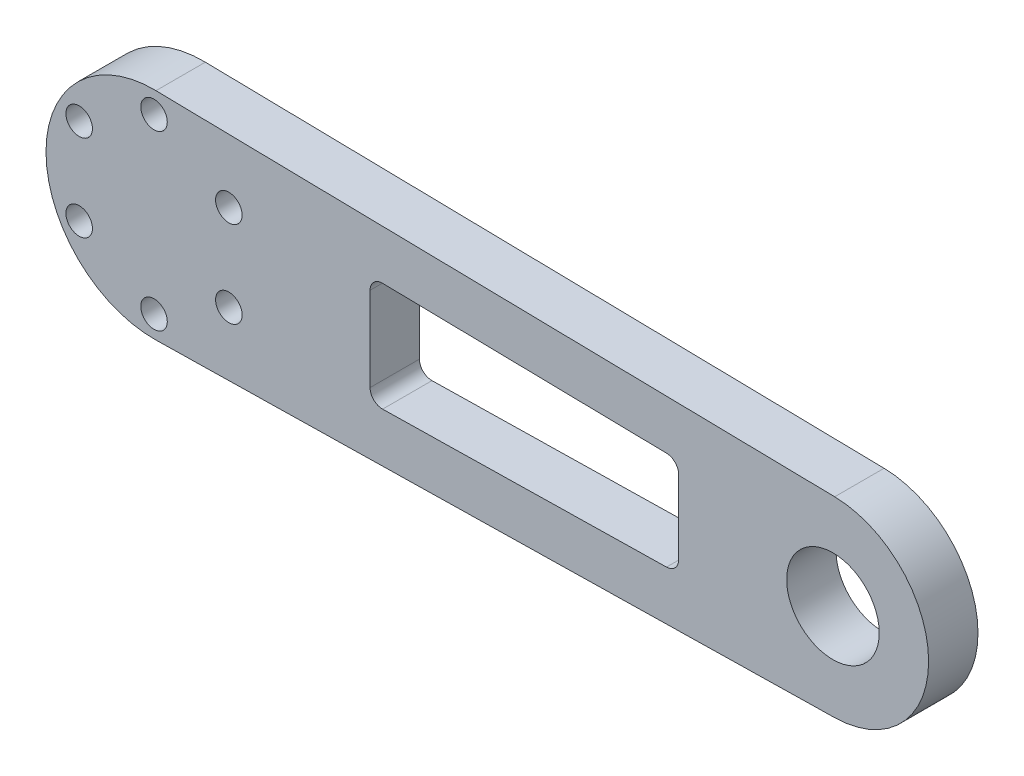
ISO-10303-21;
HEADER;
FILE_DESCRIPTION(('STEP AP214'),'2;1');
FILE_NAME('part.step','',(''),(''),'','','');
FILE_SCHEMA(('AUTOMOTIVE_DESIGN { 1 0 10303 214 1 1 1 1 }'));
ENDSEC;
DATA;
#1=APPLICATION_CONTEXT('core data for automotive mechanical design processes');
#2=APPLICATION_PROTOCOL_DEFINITION('international standard','automotive_design',2000,#1);
#3=PRODUCT_CONTEXT('',#1,'mechanical');
#4=PRODUCT('Part','Part','',(#3));
#5=PRODUCT_RELATED_PRODUCT_CATEGORY('part','',(#4));
#6=PRODUCT_DEFINITION_FORMATION('','',#4);
#7=PRODUCT_DEFINITION_CONTEXT('part definition',#1,'design');
#8=PRODUCT_DEFINITION('design','',#6,#7);
#9=PRODUCT_DEFINITION_SHAPE('','',#8);
#10=(LENGTH_UNIT() NAMED_UNIT(*) SI_UNIT(.MILLI.,.METRE.));
#11=(NAMED_UNIT(*) PLANE_ANGLE_UNIT() SI_UNIT($,.RADIAN.));
#12=(NAMED_UNIT(*) SI_UNIT($,.STERADIAN.) SOLID_ANGLE_UNIT());
#13=UNCERTAINTY_MEASURE_WITH_UNIT(LENGTH_MEASURE(1.E-05),#10,'distance_accuracy_value','');
#14=(GEOMETRIC_REPRESENTATION_CONTEXT(3) GLOBAL_UNCERTAINTY_ASSIGNED_CONTEXT((#13)) GLOBAL_UNIT_ASSIGNED_CONTEXT((#10,
#11,#12)) REPRESENTATION_CONTEXT('',''));
#15=CARTESIAN_POINT('',(0.,0.,0.));
#16=DIRECTION('',(0.,0.,1.));
#17=DIRECTION('',(1.,0.,0.));
#18=AXIS2_PLACEMENT_3D('',#15,#16,#17);
#19=CARTESIAN_POINT('',(0.,0.,8.));
#20=DIRECTION('',(0.,0.,1.));
#21=DIRECTION('',(1.,0.,0.));
#22=AXIS2_PLACEMENT_3D('',#19,#20,#21);
#23=PLANE('',#22);
#24=CARTESIAN_POINT('',(12.1243556529825,7.00000000000069,8.));
#25=DIRECTION('',(0.,0.,1.));
#26=DIRECTION('',(1.,0.,0.));
#27=AXIS2_PLACEMENT_3D('',#24,#25,#26);
#28=CIRCLE('',#27,2.15);
#29=CARTESIAN_POINT('',(14.2743556529825,7.00000000000069,8.));
#30=VERTEX_POINT('',#29);
#31=EDGE_CURVE('E529',#30,#30,#28,.T.);
#32=ORIENTED_EDGE('',*,*,#31,.F.);
#33=EDGE_LOOP('',(#32));
#34=FACE_BOUND('',#33,.T.);
#35=CARTESIAN_POINT('',(0.,14.,8.));
#36=DIRECTION('',(0.,0.,1.));
#37=DIRECTION('',(1.,0.,0.));
#38=AXIS2_PLACEMENT_3D('',#35,#36,#37);
#39=CIRCLE('',#38,2.15);
#40=CARTESIAN_POINT('',(2.15,14.,8.));
#41=VERTEX_POINT('',#40);
#42=EDGE_CURVE('E532',#41,#41,#39,.T.);
#43=ORIENTED_EDGE('',*,*,#42,.F.);
#44=EDGE_LOOP('',(#43));
#45=FACE_BOUND('',#44,.T.);
#46=CARTESIAN_POINT('',(-12.1243556529818,6.9999999999993,8.));
#47=DIRECTION('',(0.,0.,1.));
#48=DIRECTION('',(1.,0.,0.));
#49=AXIS2_PLACEMENT_3D('',#46,#47,#48);
#50=CIRCLE('',#49,2.15);
#51=CARTESIAN_POINT('',(-9.97435565298175,6.9999999999993,8.));
#52=VERTEX_POINT('',#51);
#53=EDGE_CURVE('E247',#52,#52,#50,.T.);
#54=ORIENTED_EDGE('',*,*,#53,.F.);
#55=EDGE_LOOP('',(#54));
#56=FACE_BOUND('',#55,.T.);
#57=CARTESIAN_POINT('',(-12.124355652981,-7.00000000000069,8.));
#58=DIRECTION('',(0.,0.,1.));
#59=DIRECTION('',(1.,0.,0.));
#60=AXIS2_PLACEMENT_3D('',#57,#58,#59);
#61=CIRCLE('',#60,2.15);
#62=CARTESIAN_POINT('',(-9.97435565298095,-7.00000000000069,8.));
#63=VERTEX_POINT('',#62);
#64=EDGE_CURVE('E236',#63,#63,#61,.T.);
#65=ORIENTED_EDGE('',*,*,#64,.F.);
#66=EDGE_LOOP('',(#65));
#67=FACE_BOUND('',#66,.T.);
#68=CARTESIAN_POINT('',(1.58647221154621E-12,-14.,8.));
#69=DIRECTION('',(0.,0.,1.));
#70=DIRECTION('',(1.,0.,0.));
#71=AXIS2_PLACEMENT_3D('',#68,#69,#70);
#72=CIRCLE('',#71,2.15);
#73=CARTESIAN_POINT('',(2.15000000000158,-14.,8.));
#74=VERTEX_POINT('',#73);
#75=EDGE_CURVE('E233',#74,#74,#72,.T.);
#76=ORIENTED_EDGE('',*,*,#75,.F.);
#77=EDGE_LOOP('',(#76));
#78=FACE_BOUND('',#77,.T.);
#79=CARTESIAN_POINT('',(12.1243556529833,-6.99999999999931,8.));
#80=DIRECTION('',(0.,0.,1.));
#81=DIRECTION('',(1.,0.,0.));
#82=AXIS2_PLACEMENT_3D('',#79,#80,#81);
#83=CIRCLE('',#82,2.15);
#84=CARTESIAN_POINT('',(14.2743556529833,-6.99999999999931,8.));
#85=VERTEX_POINT('',#84);
#86=EDGE_CURVE('E230',#85,#85,#83,.T.);
#87=ORIENTED_EDGE('',*,*,#86,.F.);
#88=EDGE_LOOP('',(#87));
#89=FACE_BOUND('',#88,.T.);
#90=CARTESIAN_POINT('',(0.,0.,8.));
#91=DIRECTION('',(0.,0.,1.));
#92=DIRECTION('',(1.,0.,0.));
#93=AXIS2_PLACEMENT_3D('',#90,#91,#92);
#94=CIRCLE('',#93,17.5);
#95=CARTESIAN_POINT('',(0.318181818181819,17.4971071989223,8.));
#96=VERTEX_POINT('',#95);
#97=CARTESIAN_POINT('',(0.318181818181819,-17.4971071989223,8.));
#98=VERTEX_POINT('',#97);
#99=EDGE_CURVE('E203',#96,#98,#94,.T.);
#100=ORIENTED_EDGE('',*,*,#99,.T.);
#101=DIRECTION('',(0.999834697081274,0.0181818181818182,0.));
#102=VECTOR('',#101,1.);
#103=CARTESIAN_POINT('',(0.318181818181819,-17.4971071989223,8.));
#104=LINE('',#103,#102);
#105=CARTESIAN_POINT('',(110.281818181818,-15.4974378047597,8.));
#106=VERTEX_POINT('',#105);
#107=EDGE_CURVE('E206',#98,#106,#104,.T.);
#108=ORIENTED_EDGE('',*,*,#107,.T.);
#109=CARTESIAN_POINT('',(110.,0.,8.));
#110=DIRECTION('',(0.,0.,1.));
#111=DIRECTION('',(-1.,0.,0.));
#112=AXIS2_PLACEMENT_3D('',#109,#110,#111);
#113=CIRCLE('',#112,15.5);
#114=CARTESIAN_POINT('',(110.281818181818,15.4974378047597,8.));
#115=VERTEX_POINT('',#114);
#116=EDGE_CURVE('E209',#106,#115,#113,.T.);
#117=ORIENTED_EDGE('',*,*,#116,.T.);
#118=DIRECTION('',(-0.999834697081274,0.0181818181818182,0.));
#119=VECTOR('',#118,1.);
#120=CARTESIAN_POINT('',(0.318181818181819,17.4971071989223,8.));
#121=LINE('',#120,#119);
#122=EDGE_CURVE('E211',#115,#96,#121,.T.);
#123=ORIENTED_EDGE('',*,*,#122,.T.);
#124=EDGE_LOOP('',(#100,#108,#117,#123));
#125=FACE_BOUND('',#124,.T.);
#126=CARTESIAN_POINT('',(110.,0.,8.));
#127=DIRECTION('',(0.,0.,1.));
#128=DIRECTION('',(1.,0.,0.));
#129=AXIS2_PLACEMENT_3D('',#126,#127,#128);
#130=CIRCLE('',#129,7.50000000000001);
#131=CARTESIAN_POINT('',(117.5,0.,8.));
#132=VERTEX_POINT('',#131);
#133=EDGE_CURVE('E197',#132,#132,#130,.T.);
#134=ORIENTED_EDGE('',*,*,#133,.F.);
#135=EDGE_LOOP('',(#134));
#136=FACE_BOUND('',#135,.T.);
#137=DIRECTION('',(-0.999834697081274,0.0181818181818182,0.));
#138=VECTOR('',#137,1.);
#139=CARTESIAN_POINT('',(37.0363636363636,8.82807087613048,8.));
#140=LINE('',#139,#138);
#141=CARTESIAN_POINT('',(83.0363636363636,7.99156896355917,8.));
#142=VERTEX_POINT('',#141);
#143=CARTESIAN_POINT('',(37.0363636363636,8.82807087613048,8.));
#144=VERTEX_POINT('',#143);
#145=EDGE_CURVE('E138',#142,#144,#140,.T.);
#146=ORIENTED_EDGE('',*,*,#145,.F.);
#147=CARTESIAN_POINT('',(83.,5.99189956939662,8.));
#148=DIRECTION('',(0.,0.,1.));
#149=DIRECTION('',(-1.,0.,0.));
#150=AXIS2_PLACEMENT_3D('',#147,#148,#149);
#151=CIRCLE('',#150,2.00000000000001);
#152=CARTESIAN_POINT('',(85.,5.99189956939662,8.));
#153=VERTEX_POINT('',#152);
#154=EDGE_CURVE('E130',#153,#142,#151,.T.);
#155=ORIENTED_EDGE('',*,*,#154,.F.);
#156=DIRECTION('',(0.,1.,0.));
#157=VECTOR('',#156,1.);
#158=CARTESIAN_POINT('',(85.,5.99189956939662,8.));
#159=LINE('',#158,#157);
#160=CARTESIAN_POINT('',(85.,-5.99189956939662,8.));
#161=VERTEX_POINT('',#160);
#162=EDGE_CURVE('E164',#161,#153,#159,.T.);
#163=ORIENTED_EDGE('',*,*,#162,.F.);
#164=CARTESIAN_POINT('',(83.,-5.99189956939662,8.));
#165=DIRECTION('',(0.,0.,1.));
#166=DIRECTION('',(1.,0.,0.));
#167=AXIS2_PLACEMENT_3D('',#164,#165,#166);
#168=CIRCLE('',#167,2.00000000000001);
#169=CARTESIAN_POINT('',(83.0363636363636,-7.99156896355917,8.));
#170=VERTEX_POINT('',#169);
#171=EDGE_CURVE('E162',#170,#161,#168,.T.);
#172=ORIENTED_EDGE('',*,*,#171,.F.);
#173=DIRECTION('',(0.999834697081274,0.0181818181818182,0.));
#174=VECTOR('',#173,1.);
#175=CARTESIAN_POINT('',(37.0363636363636,-8.82807087613048,8.));
#176=LINE('',#175,#174);
#177=CARTESIAN_POINT('',(37.0363636363636,-8.82807087613048,8.));
#178=VERTEX_POINT('',#177);
#179=EDGE_CURVE('E160',#178,#170,#176,.T.);
#180=ORIENTED_EDGE('',*,*,#179,.F.);
#181=CARTESIAN_POINT('',(37.,-6.82840148196793,8.));
#182=DIRECTION('',(0.,0.,1.));
#183=DIRECTION('',(1.,0.,0.));
#184=AXIS2_PLACEMENT_3D('',#181,#182,#183);
#185=CIRCLE('',#184,2.);
#186=CARTESIAN_POINT('',(35.,-6.82840148196793,8.));
#187=VERTEX_POINT('',#186);
#188=EDGE_CURVE('E158',#187,#178,#185,.T.);
#189=ORIENTED_EDGE('',*,*,#188,.F.);
#190=DIRECTION('',(0.,-1.,0.));
#191=VECTOR('',#190,1.);
#192=CARTESIAN_POINT('',(35.,6.82840148196793,8.));
#193=LINE('',#192,#191);
#194=CARTESIAN_POINT('',(35.,6.82840148196793,8.));
#195=VERTEX_POINT('',#194);
#196=EDGE_CURVE('E153',#195,#187,#193,.T.);
#197=ORIENTED_EDGE('',*,*,#196,.F.);
#198=CARTESIAN_POINT('',(37.,6.82840148196793,8.));
#199=DIRECTION('',(0.,0.,1.));
#200=DIRECTION('',(-1.,0.,0.));
#201=AXIS2_PLACEMENT_3D('',#198,#199,#200);
#202=CIRCLE('',#201,2.);
#203=EDGE_CURVE('E151',#144,#195,#202,.T.);
#204=ORIENTED_EDGE('',*,*,#203,.F.);
#205=EDGE_LOOP('',(#146,#155,#163,#172,#180,#189,#197,#204));
#206=FACE_BOUND('',#205,.T.);
#207=ADVANCED_FACE('F39',(#34,#45,#56,#67,#78,#89,#125,#136,#206),#23,.T.);
#208=CARTESIAN_POINT('',(0.,0.,0.));
#209=DIRECTION('',(0.,0.,1.));
#210=DIRECTION('',(1.,0.,0.));
#211=AXIS2_PLACEMENT_3D('',#208,#209,#210);
#212=PLANE('',#211);
#213=CARTESIAN_POINT('',(12.1243556529825,7.00000000000069,0.));
#214=DIRECTION('',(0.,0.,1.));
#215=DIRECTION('',(1.,0.,0.));
#216=AXIS2_PLACEMENT_3D('',#213,#214,#215);
#217=CIRCLE('',#216,2.15);
#218=CARTESIAN_POINT('',(14.2743556529825,7.00000000000069,0.));
#219=VERTEX_POINT('',#218);
#220=EDGE_CURVE('E43',#219,#219,#217,.T.);
#221=ORIENTED_EDGE('',*,*,#220,.T.);
#222=EDGE_LOOP('',(#221));
#223=FACE_BOUND('',#222,.T.);
#224=CARTESIAN_POINT('',(0.,14.,0.));
#225=DIRECTION('',(0.,0.,1.));
#226=DIRECTION('',(1.,0.,0.));
#227=AXIS2_PLACEMENT_3D('',#224,#225,#226);
#228=CIRCLE('',#227,2.15);
#229=CARTESIAN_POINT('',(2.15,14.,0.));
#230=VERTEX_POINT('',#229);
#231=EDGE_CURVE('E534',#230,#230,#228,.T.);
#232=ORIENTED_EDGE('',*,*,#231,.T.);
#233=EDGE_LOOP('',(#232));
#234=FACE_BOUND('',#233,.T.);
#235=CARTESIAN_POINT('',(-12.1243556529818,6.9999999999993,0.));
#236=DIRECTION('',(0.,0.,1.));
#237=DIRECTION('',(1.,0.,0.));
#238=AXIS2_PLACEMENT_3D('',#235,#236,#237);
#239=CIRCLE('',#238,2.15);
#240=CARTESIAN_POINT('',(-9.97435565298176,6.9999999999993,0.));
#241=VERTEX_POINT('',#240);
#242=EDGE_CURVE('E242',#241,#241,#239,.T.);
#243=ORIENTED_EDGE('',*,*,#242,.T.);
#244=EDGE_LOOP('',(#243));
#245=FACE_BOUND('',#244,.T.);
#246=CARTESIAN_POINT('',(-12.124355652981,-7.00000000000069,0.));
#247=DIRECTION('',(0.,0.,1.));
#248=DIRECTION('',(1.,0.,0.));
#249=AXIS2_PLACEMENT_3D('',#246,#247,#248);
#250=CIRCLE('',#249,2.15);
#251=CARTESIAN_POINT('',(-9.97435565298096,-7.00000000000069,0.));
#252=VERTEX_POINT('',#251);
#253=EDGE_CURVE('E234',#252,#252,#250,.T.);
#254=ORIENTED_EDGE('',*,*,#253,.T.);
#255=EDGE_LOOP('',(#254));
#256=FACE_BOUND('',#255,.T.);
#257=CARTESIAN_POINT('',(1.58647221154621E-12,-14.,0.));
#258=DIRECTION('',(0.,0.,1.));
#259=DIRECTION('',(1.,0.,0.));
#260=AXIS2_PLACEMENT_3D('',#257,#258,#259);
#261=CIRCLE('',#260,2.15);
#262=CARTESIAN_POINT('',(2.15000000000158,-14.,0.));
#263=VERTEX_POINT('',#262);
#264=EDGE_CURVE('E231',#263,#263,#261,.T.);
#265=ORIENTED_EDGE('',*,*,#264,.T.);
#266=EDGE_LOOP('',(#265));
#267=FACE_BOUND('',#266,.T.);
#268=CARTESIAN_POINT('',(12.1243556529833,-6.99999999999931,0.));
#269=DIRECTION('',(0.,0.,1.));
#270=DIRECTION('',(1.,0.,0.));
#271=AXIS2_PLACEMENT_3D('',#268,#269,#270);
#272=CIRCLE('',#271,2.15);
#273=CARTESIAN_POINT('',(14.2743556529833,-6.99999999999931,0.));
#274=VERTEX_POINT('',#273);
#275=EDGE_CURVE('E167',#274,#274,#272,.T.);
#276=ORIENTED_EDGE('',*,*,#275,.T.);
#277=EDGE_LOOP('',(#276));
#278=FACE_BOUND('',#277,.T.);
#279=CARTESIAN_POINT('',(110.,0.,0.));
#280=DIRECTION('',(0.,0.,1.));
#281=DIRECTION('',(1.,0.,0.));
#282=AXIS2_PLACEMENT_3D('',#279,#280,#281);
#283=CIRCLE('',#282,7.50000000000001);
#284=CARTESIAN_POINT('',(117.5,0.,0.));
#285=VERTEX_POINT('',#284);
#286=EDGE_CURVE('E146',#285,#285,#283,.T.);
#287=ORIENTED_EDGE('',*,*,#286,.T.);
#288=EDGE_LOOP('',(#287));
#289=FACE_BOUND('',#288,.T.);
#290=CARTESIAN_POINT('',(0.,0.,0.));
#291=DIRECTION('',(0.,0.,1.));
#292=DIRECTION('',(1.,0.,0.));
#293=AXIS2_PLACEMENT_3D('',#290,#291,#292);
#294=CIRCLE('',#293,17.5);
#295=CARTESIAN_POINT('',(0.318181818181819,17.4971071989223,0.));
#296=VERTEX_POINT('',#295);
#297=CARTESIAN_POINT('',(0.318181818181819,-17.4971071989223,0.));
#298=VERTEX_POINT('',#297);
#299=EDGE_CURVE('E200',#296,#298,#294,.T.);
#300=ORIENTED_EDGE('',*,*,#299,.F.);
#301=DIRECTION('',(-0.999834697081274,0.0181818181818182,0.));
#302=VECTOR('',#301,1.);
#303=CARTESIAN_POINT('',(0.318181818181819,17.4971071989223,0.));
#304=LINE('',#303,#302);
#305=CARTESIAN_POINT('',(110.281818181818,15.4974378047597,0.));
#306=VERTEX_POINT('',#305);
#307=EDGE_CURVE('E207',#306,#296,#304,.T.);
#308=ORIENTED_EDGE('',*,*,#307,.F.);
#309=CARTESIAN_POINT('',(110.,0.,0.));
#310=DIRECTION('',(0.,0.,1.));
#311=DIRECTION('',(-1.,0.,0.));
#312=AXIS2_PLACEMENT_3D('',#309,#310,#311);
#313=CIRCLE('',#312,15.5);
#314=CARTESIAN_POINT('',(110.281818181818,-15.4974378047597,0.));
#315=VERTEX_POINT('',#314);
#316=EDGE_CURVE('E218',#315,#306,#313,.T.);
#317=ORIENTED_EDGE('',*,*,#316,.F.);
#318=DIRECTION('',(0.999834697081274,0.0181818181818182,0.));
#319=VECTOR('',#318,1.);
#320=CARTESIAN_POINT('',(0.318181818181819,-17.4971071989223,0.));
#321=LINE('',#320,#319);
#322=EDGE_CURVE('E216',#298,#315,#321,.T.);
#323=ORIENTED_EDGE('',*,*,#322,.F.);
#324=EDGE_LOOP('',(#300,#308,#317,#323));
#325=FACE_BOUND('',#324,.T.);
#326=CARTESIAN_POINT('',(83.,5.99189956939662,0.));
#327=DIRECTION('',(0.,0.,1.));
#328=DIRECTION('',(-1.,0.,0.));
#329=AXIS2_PLACEMENT_3D('',#326,#327,#328);
#330=CIRCLE('',#329,2.00000000000001);
#331=CARTESIAN_POINT('',(85.,5.99189956939662,0.));
#332=VERTEX_POINT('',#331);
#333=CARTESIAN_POINT('',(83.0363636363636,7.99156896355917,0.));
#334=VERTEX_POINT('',#333);
#335=EDGE_CURVE('E64',#332,#334,#330,.T.);
#336=ORIENTED_EDGE('',*,*,#335,.T.);
#337=DIRECTION('',(-0.999834697081274,0.0181818181818182,0.));
#338=VECTOR('',#337,1.);
#339=CARTESIAN_POINT('',(37.0363636363636,8.82807087613048,0.));
#340=LINE('',#339,#338);
#341=CARTESIAN_POINT('',(37.0363636363636,8.82807087613048,0.));
#342=VERTEX_POINT('',#341);
#343=EDGE_CURVE('E145',#334,#342,#340,.T.);
#344=ORIENTED_EDGE('',*,*,#343,.T.);
#345=CARTESIAN_POINT('',(37.,6.82840148196793,0.));
#346=DIRECTION('',(0.,0.,1.));
#347=DIRECTION('',(-1.,0.,0.));
#348=AXIS2_PLACEMENT_3D('',#345,#346,#347);
#349=CIRCLE('',#348,2.);
#350=CARTESIAN_POINT('',(35.,6.82840148196793,0.));
#351=VERTEX_POINT('',#350);
#352=EDGE_CURVE('E169',#342,#351,#349,.T.);
#353=ORIENTED_EDGE('',*,*,#352,.T.);
#354=DIRECTION('',(0.,-1.,0.));
#355=VECTOR('',#354,1.);
#356=CARTESIAN_POINT('',(35.,6.82840148196793,0.));
#357=LINE('',#356,#355);
#358=CARTESIAN_POINT('',(35.,-6.82840148196793,0.));
#359=VERTEX_POINT('',#358);
#360=EDGE_CURVE('E172',#351,#359,#357,.T.);
#361=ORIENTED_EDGE('',*,*,#360,.T.);
#362=CARTESIAN_POINT('',(37.,-6.82840148196793,0.));
#363=DIRECTION('',(0.,0.,1.));
#364=DIRECTION('',(1.,0.,0.));
#365=AXIS2_PLACEMENT_3D('',#362,#363,#364);
#366=CIRCLE('',#365,2.);
#367=CARTESIAN_POINT('',(37.0363636363636,-8.82807087613048,0.));
#368=VERTEX_POINT('',#367);
#369=EDGE_CURVE('E175',#359,#368,#366,.T.);
#370=ORIENTED_EDGE('',*,*,#369,.T.);
#371=DIRECTION('',(0.999834697081274,0.0181818181818182,0.));
#372=VECTOR('',#371,1.);
#373=CARTESIAN_POINT('',(37.0363636363636,-8.82807087613048,0.));
#374=LINE('',#373,#372);
#375=CARTESIAN_POINT('',(83.0363636363636,-7.99156896355917,0.));
#376=VERTEX_POINT('',#375);
#377=EDGE_CURVE('E178',#368,#376,#374,.T.);
#378=ORIENTED_EDGE('',*,*,#377,.T.);
#379=CARTESIAN_POINT('',(83.,-5.99189956939662,0.));
#380=DIRECTION('',(0.,0.,1.));
#381=DIRECTION('',(1.,0.,0.));
#382=AXIS2_PLACEMENT_3D('',#379,#380,#381);
#383=CIRCLE('',#382,2.00000000000001);
#384=CARTESIAN_POINT('',(85.,-5.99189956939662,0.));
#385=VERTEX_POINT('',#384);
#386=EDGE_CURVE('E181',#376,#385,#383,.T.);
#387=ORIENTED_EDGE('',*,*,#386,.T.);
#388=DIRECTION('',(0.,1.,0.));
#389=VECTOR('',#388,1.);
#390=CARTESIAN_POINT('',(85.,5.99189956939662,0.));
#391=LINE('',#390,#389);
#392=EDGE_CURVE('E139',#385,#332,#391,.T.);
#393=ORIENTED_EDGE('',*,*,#392,.T.);
#394=EDGE_LOOP('',(#336,#344,#353,#361,#370,#378,#387,#393));
#395=FACE_BOUND('',#394,.T.);
#396=ADVANCED_FACE('F258',(#223,#234,#245,#256,#267,#278,#289,#325,#395),#212,.F.);
#397=CARTESIAN_POINT('',(0.,0.,8.));
#398=DIRECTION('',(0.,0.,-1.));
#399=DIRECTION('',(-1.,0.,0.));
#400=AXIS2_PLACEMENT_3D('',#397,#398,#399);
#401=CYLINDRICAL_SURFACE('',#400,17.5);
#402=ORIENTED_EDGE('',*,*,#299,.T.);
#403=DIRECTION('',(0.,0.,-1.));
#404=VECTOR('',#403,1.);
#405=CARTESIAN_POINT('',(0.318181818181819,-17.4971071989223,8.));
#406=LINE('',#405,#404);
#407=EDGE_CURVE('E11',#98,#298,#406,.T.);
#408=ORIENTED_EDGE('',*,*,#407,.F.);
#409=ORIENTED_EDGE('',*,*,#99,.F.);
#410=DIRECTION('',(0.,0.,-1.));
#411=VECTOR('',#410,1.);
#412=CARTESIAN_POINT('',(0.318181818181819,17.4971071989223,8.));
#413=LINE('',#412,#411);
#414=EDGE_CURVE('E213',#96,#296,#413,.T.);
#415=ORIENTED_EDGE('',*,*,#414,.T.);
#416=EDGE_LOOP('',(#402,#408,#409,#415));
#417=FACE_BOUND('',#416,.T.);
#418=ADVANCED_FACE('F41',(#417),#401,.T.);
#419=CARTESIAN_POINT('',(0.318181818181819,-17.4971071989223,8.));
#420=DIRECTION('',(-0.0181818181818182,0.999834697081274,0.));
#421=DIRECTION('',(-0.999834697081274,-0.0181818181818182,0.));
#422=AXIS2_PLACEMENT_3D('',#419,#420,#421);
#423=PLANE('',#422);
#424=ORIENTED_EDGE('',*,*,#322,.T.);
#425=DIRECTION('',(0.,0.,-1.));
#426=VECTOR('',#425,1.);
#427=CARTESIAN_POINT('',(110.281818181818,-15.4974378047597,8.));
#428=LINE('',#427,#426);
#429=EDGE_CURVE('E48',#106,#315,#428,.T.);
#430=ORIENTED_EDGE('',*,*,#429,.F.);
#431=ORIENTED_EDGE('',*,*,#107,.F.);
#432=ORIENTED_EDGE('',*,*,#407,.T.);
#433=EDGE_LOOP('',(#424,#430,#431,#432));
#434=FACE_BOUND('',#433,.T.);
#435=ADVANCED_FACE('F320',(#434),#423,.F.);
#436=CARTESIAN_POINT('',(110.,0.,8.));
#437=DIRECTION('',(0.,0.,-1.));
#438=DIRECTION('',(-1.,0.,0.));
#439=AXIS2_PLACEMENT_3D('',#436,#437,#438);
#440=CYLINDRICAL_SURFACE('',#439,15.5);
#441=ORIENTED_EDGE('',*,*,#316,.T.);
#442=DIRECTION('',(0.,0.,-1.));
#443=VECTOR('',#442,1.);
#444=CARTESIAN_POINT('',(110.281818181818,15.4974378047597,8.));
#445=LINE('',#444,#443);
#446=EDGE_CURVE('E223',#115,#306,#445,.T.);
#447=ORIENTED_EDGE('',*,*,#446,.F.);
#448=ORIENTED_EDGE('',*,*,#116,.F.);
#449=ORIENTED_EDGE('',*,*,#429,.T.);
#450=EDGE_LOOP('',(#441,#447,#448,#449));
#451=FACE_BOUND('',#450,.T.);
#452=ADVANCED_FACE('F317',(#451),#440,.T.);
#453=CARTESIAN_POINT('',(0.318181818181819,17.4971071989223,8.));
#454=DIRECTION('',(-0.0181818181818182,-0.999834697081274,0.));
#455=DIRECTION('',(0.999834697081274,-0.0181818181818182,0.));
#456=AXIS2_PLACEMENT_3D('',#453,#454,#455);
#457=PLANE('',#456);
#458=ORIENTED_EDGE('',*,*,#307,.T.);
#459=ORIENTED_EDGE('',*,*,#414,.F.);
#460=ORIENTED_EDGE('',*,*,#122,.F.);
#461=ORIENTED_EDGE('',*,*,#446,.T.);
#462=EDGE_LOOP('',(#458,#459,#460,#461));
#463=FACE_BOUND('',#462,.T.);
#464=ADVANCED_FACE('F269',(#463),#457,.F.);
#465=CARTESIAN_POINT('',(110.,0.,8.));
#466=DIRECTION('',(0.,0.,-1.));
#467=DIRECTION('',(-1.,0.,0.));
#468=AXIS2_PLACEMENT_3D('',#465,#466,#467);
#469=CYLINDRICAL_SURFACE('',#468,7.50000000000001);
#470=ORIENTED_EDGE('',*,*,#133,.T.);
#471=EDGE_LOOP('',(#470));
#472=FACE_BOUND('',#471,.T.);
#473=ORIENTED_EDGE('',*,*,#286,.F.);
#474=EDGE_LOOP('',(#473));
#475=FACE_BOUND('',#474,.T.);
#476=ADVANCED_FACE('F266',(#472,#475),#469,.F.);
#477=CARTESIAN_POINT('',(83.,5.99189956939662,8.));
#478=DIRECTION('',(0.,0.,-1.));
#479=DIRECTION('',(-1.,0.,0.));
#480=AXIS2_PLACEMENT_3D('',#477,#478,#479);
#481=CYLINDRICAL_SURFACE('',#480,2.00000000000001);
#482=ORIENTED_EDGE('',*,*,#335,.F.);
#483=DIRECTION('',(0.,0.,-1.));
#484=VECTOR('',#483,1.);
#485=CARTESIAN_POINT('',(85.,5.99189956939662,8.));
#486=LINE('',#485,#484);
#487=EDGE_CURVE('E134',#153,#332,#486,.T.);
#488=ORIENTED_EDGE('',*,*,#487,.F.);
#489=ORIENTED_EDGE('',*,*,#154,.T.);
#490=DIRECTION('',(0.,0.,-1.));
#491=VECTOR('',#490,1.);
#492=CARTESIAN_POINT('',(83.0363636363636,7.99156896355917,8.));
#493=LINE('',#492,#491);
#494=EDGE_CURVE('E133',#142,#334,#493,.T.);
#495=ORIENTED_EDGE('',*,*,#494,.T.);
#496=EDGE_LOOP('',(#482,#488,#489,#495));
#497=FACE_BOUND('',#496,.T.);
#498=ADVANCED_FACE('F132',(#497),#481,.F.);
#499=CARTESIAN_POINT('',(37.0363636363636,8.82807087613048,8.));
#500=DIRECTION('',(-0.0181818181818182,-0.999834697081274,0.));
#501=DIRECTION('',(0.999834697081274,-0.0181818181818182,0.));
#502=AXIS2_PLACEMENT_3D('',#499,#500,#501);
#503=PLANE('',#502);
#504=ORIENTED_EDGE('',*,*,#343,.F.);
#505=ORIENTED_EDGE('',*,*,#494,.F.);
#506=ORIENTED_EDGE('',*,*,#145,.T.);
#507=DIRECTION('',(0.,0.,-1.));
#508=VECTOR('',#507,1.);
#509=CARTESIAN_POINT('',(37.0363636363636,8.82807087613048,8.));
#510=LINE('',#509,#508);
#511=EDGE_CURVE('E147',#144,#342,#510,.T.);
#512=ORIENTED_EDGE('',*,*,#511,.T.);
#513=EDGE_LOOP('',(#504,#505,#506,#512));
#514=FACE_BOUND('',#513,.T.);
#515=ADVANCED_FACE('F142',(#514),#503,.T.);
#516=CARTESIAN_POINT('',(37.,6.82840148196793,8.));
#517=DIRECTION('',(0.,0.,-1.));
#518=DIRECTION('',(-1.,0.,0.));
#519=AXIS2_PLACEMENT_3D('',#516,#517,#518);
#520=CYLINDRICAL_SURFACE('',#519,2.);
#521=ORIENTED_EDGE('',*,*,#352,.F.);
#522=ORIENTED_EDGE('',*,*,#511,.F.);
#523=ORIENTED_EDGE('',*,*,#203,.T.);
#524=DIRECTION('',(0.,0.,-1.));
#525=VECTOR('',#524,1.);
#526=CARTESIAN_POINT('',(35.,6.82840148196793,8.));
#527=LINE('',#526,#525);
#528=EDGE_CURVE('E194',#195,#351,#527,.T.);
#529=ORIENTED_EDGE('',*,*,#528,.T.);
#530=EDGE_LOOP('',(#521,#522,#523,#529));
#531=FACE_BOUND('',#530,.T.);
#532=ADVANCED_FACE('F302',(#531),#520,.F.);
#533=CARTESIAN_POINT('',(35.,6.82840148196793,8.));
#534=DIRECTION('',(1.,0.,0.));
#535=DIRECTION('',(0.,0.,-1.));
#536=AXIS2_PLACEMENT_3D('',#533,#534,#535);
#537=PLANE('',#536);
#538=ORIENTED_EDGE('',*,*,#360,.F.);
#539=ORIENTED_EDGE('',*,*,#528,.F.);
#540=ORIENTED_EDGE('',*,*,#196,.T.);
#541=DIRECTION('',(0.,0.,-1.));
#542=VECTOR('',#541,1.);
#543=CARTESIAN_POINT('',(35.,-6.82840148196793,8.));
#544=LINE('',#543,#542);
#545=EDGE_CURVE('E192',#187,#359,#544,.T.);
#546=ORIENTED_EDGE('',*,*,#545,.T.);
#547=EDGE_LOOP('',(#538,#539,#540,#546));
#548=FACE_BOUND('',#547,.T.);
#549=ADVANCED_FACE('F299',(#548),#537,.T.);
#550=CARTESIAN_POINT('',(37.,-6.82840148196793,8.));
#551=DIRECTION('',(0.,0.,-1.));
#552=DIRECTION('',(-1.,0.,0.));
#553=AXIS2_PLACEMENT_3D('',#550,#551,#552);
#554=CYLINDRICAL_SURFACE('',#553,2.);
#555=ORIENTED_EDGE('',*,*,#369,.F.);
#556=ORIENTED_EDGE('',*,*,#545,.F.);
#557=ORIENTED_EDGE('',*,*,#188,.T.);
#558=DIRECTION('',(0.,0.,-1.));
#559=VECTOR('',#558,1.);
#560=CARTESIAN_POINT('',(37.0363636363636,-8.82807087613048,8.));
#561=LINE('',#560,#559);
#562=EDGE_CURVE('E190',#178,#368,#561,.T.);
#563=ORIENTED_EDGE('',*,*,#562,.T.);
#564=EDGE_LOOP('',(#555,#556,#557,#563));
#565=FACE_BOUND('',#564,.T.);
#566=ADVANCED_FACE('F294',(#565),#554,.F.);
#567=CARTESIAN_POINT('',(37.0363636363636,-8.82807087613048,8.));
#568=DIRECTION('',(-0.0181818181818182,0.999834697081274,0.));
#569=DIRECTION('',(-0.999834697081274,-0.0181818181818182,0.));
#570=AXIS2_PLACEMENT_3D('',#567,#568,#569);
#571=PLANE('',#570);
#572=ORIENTED_EDGE('',*,*,#377,.F.);
#573=ORIENTED_EDGE('',*,*,#562,.F.);
#574=ORIENTED_EDGE('',*,*,#179,.T.);
#575=DIRECTION('',(0.,0.,-1.));
#576=VECTOR('',#575,1.);
#577=CARTESIAN_POINT('',(83.0363636363636,-7.99156896355917,8.));
#578=LINE('',#577,#576);
#579=EDGE_CURVE('E188',#170,#376,#578,.T.);
#580=ORIENTED_EDGE('',*,*,#579,.T.);
#581=EDGE_LOOP('',(#572,#573,#574,#580));
#582=FACE_BOUND('',#581,.T.);
#583=ADVANCED_FACE('F290',(#582),#571,.T.);
#584=CARTESIAN_POINT('',(83.,-5.99189956939662,8.));
#585=DIRECTION('',(0.,0.,-1.));
#586=DIRECTION('',(-1.,0.,0.));
#587=AXIS2_PLACEMENT_3D('',#584,#585,#586);
#588=CYLINDRICAL_SURFACE('',#587,2.00000000000001);
#589=ORIENTED_EDGE('',*,*,#386,.F.);
#590=ORIENTED_EDGE('',*,*,#579,.F.);
#591=ORIENTED_EDGE('',*,*,#171,.T.);
#592=DIRECTION('',(0.,0.,-1.));
#593=VECTOR('',#592,1.);
#594=CARTESIAN_POINT('',(85.,-5.99189956939662,8.));
#595=LINE('',#594,#593);
#596=EDGE_CURVE('E56',#161,#385,#595,.T.);
#597=ORIENTED_EDGE('',*,*,#596,.T.);
#598=EDGE_LOOP('',(#589,#590,#591,#597));
#599=FACE_BOUND('',#598,.T.);
#600=ADVANCED_FACE('F287',(#599),#588,.F.);
#601=CARTESIAN_POINT('',(85.,5.99189956939662,8.));
#602=DIRECTION('',(-1.,0.,0.));
#603=DIRECTION('',(0.,0.,1.));
#604=AXIS2_PLACEMENT_3D('',#601,#602,#603);
#605=PLANE('',#604);
#606=ORIENTED_EDGE('',*,*,#392,.F.);
#607=ORIENTED_EDGE('',*,*,#596,.F.);
#608=ORIENTED_EDGE('',*,*,#162,.T.);
#609=ORIENTED_EDGE('',*,*,#487,.T.);
#610=EDGE_LOOP('',(#606,#607,#608,#609));
#611=FACE_BOUND('',#610,.T.);
#612=ADVANCED_FACE('F281',(#611),#605,.T.);
#613=CARTESIAN_POINT('',(12.1243556529833,-6.99999999999931,8.));
#614=DIRECTION('',(0.,0.,1.));
#615=DIRECTION('',(1.,0.,0.));
#616=AXIS2_PLACEMENT_3D('',#613,#614,#615);
#617=CYLINDRICAL_SURFACE('',#616,2.15);
#618=ORIENTED_EDGE('',*,*,#86,.T.);
#619=EDGE_LOOP('',(#618));
#620=FACE_BOUND('',#619,.T.);
#621=ORIENTED_EDGE('',*,*,#275,.F.);
#622=EDGE_LOOP('',(#621));
#623=FACE_BOUND('',#622,.T.);
#624=ADVANCED_FACE('F253',(#620,#623),#617,.F.);
#625=CARTESIAN_POINT('',(1.58647221154621E-12,-14.,8.));
#626=DIRECTION('',(0.,0.,1.));
#627=DIRECTION('',(1.,0.,0.));
#628=AXIS2_PLACEMENT_3D('',#625,#626,#627);
#629=CYLINDRICAL_SURFACE('',#628,2.15);
#630=ORIENTED_EDGE('',*,*,#75,.T.);
#631=EDGE_LOOP('',(#630));
#632=FACE_BOUND('',#631,.T.);
#633=ORIENTED_EDGE('',*,*,#264,.F.);
#634=EDGE_LOOP('',(#633));
#635=FACE_BOUND('',#634,.T.);
#636=ADVANCED_FACE('F463',(#632,#635),#629,.F.);
#637=CARTESIAN_POINT('',(-12.124355652981,-7.00000000000069,8.));
#638=DIRECTION('',(0.,0.,1.));
#639=DIRECTION('',(1.,0.,0.));
#640=AXIS2_PLACEMENT_3D('',#637,#638,#639);
#641=CYLINDRICAL_SURFACE('',#640,2.15);
#642=ORIENTED_EDGE('',*,*,#64,.T.);
#643=EDGE_LOOP('',(#642));
#644=FACE_BOUND('',#643,.T.);
#645=ORIENTED_EDGE('',*,*,#253,.F.);
#646=EDGE_LOOP('',(#645));
#647=FACE_BOUND('',#646,.T.);
#648=ADVANCED_FACE('F471',(#644,#647),#641,.F.);
#649=CARTESIAN_POINT('',(-12.1243556529818,6.9999999999993,8.));
#650=DIRECTION('',(0.,0.,1.));
#651=DIRECTION('',(1.,0.,0.));
#652=AXIS2_PLACEMENT_3D('',#649,#650,#651);
#653=CYLINDRICAL_SURFACE('',#652,2.15);
#654=ORIENTED_EDGE('',*,*,#53,.T.);
#655=EDGE_LOOP('',(#654));
#656=FACE_BOUND('',#655,.T.);
#657=ORIENTED_EDGE('',*,*,#242,.F.);
#658=EDGE_LOOP('',(#657));
#659=FACE_BOUND('',#658,.T.);
#660=ADVANCED_FACE('F481',(#656,#659),#653,.F.);
#661=CARTESIAN_POINT('',(0.,14.,8.));
#662=DIRECTION('',(0.,0.,1.));
#663=DIRECTION('',(1.,0.,0.));
#664=AXIS2_PLACEMENT_3D('',#661,#662,#663);
#665=CYLINDRICAL_SURFACE('',#664,2.15);
#666=ORIENTED_EDGE('',*,*,#42,.T.);
#667=EDGE_LOOP('',(#666));
#668=FACE_BOUND('',#667,.T.);
#669=ORIENTED_EDGE('',*,*,#231,.F.);
#670=EDGE_LOOP('',(#669));
#671=FACE_BOUND('',#670,.T.);
#672=ADVANCED_FACE('F490',(#668,#671),#665,.F.);
#673=CARTESIAN_POINT('',(12.1243556529825,7.00000000000069,8.));
#674=DIRECTION('',(0.,0.,1.));
#675=DIRECTION('',(1.,0.,0.));
#676=AXIS2_PLACEMENT_3D('',#673,#674,#675);
#677=CYLINDRICAL_SURFACE('',#676,2.15);
#678=ORIENTED_EDGE('',*,*,#31,.T.);
#679=EDGE_LOOP('',(#678));
#680=FACE_BOUND('',#679,.T.);
#681=ORIENTED_EDGE('',*,*,#220,.F.);
#682=EDGE_LOOP('',(#681));
#683=FACE_BOUND('',#682,.T.);
#684=ADVANCED_FACE('F500',(#680,#683),#677,.F.);
#685=CLOSED_SHELL('',(#207,#396,#418,#435,#452,#464,#476,#498,#515,#532,#549,#566,#583,#600,
#612,#624,#636,#648,#660,#672,#684));
#686=MANIFOLD_SOLID_BREP('B2',#685);
#687=ADVANCED_BREP_SHAPE_REPRESENTATION('',(#18,#686),#14);
#688=SHAPE_DEFINITION_REPRESENTATION(#9,#687);
ENDSEC;
END-ISO-10303-21;
